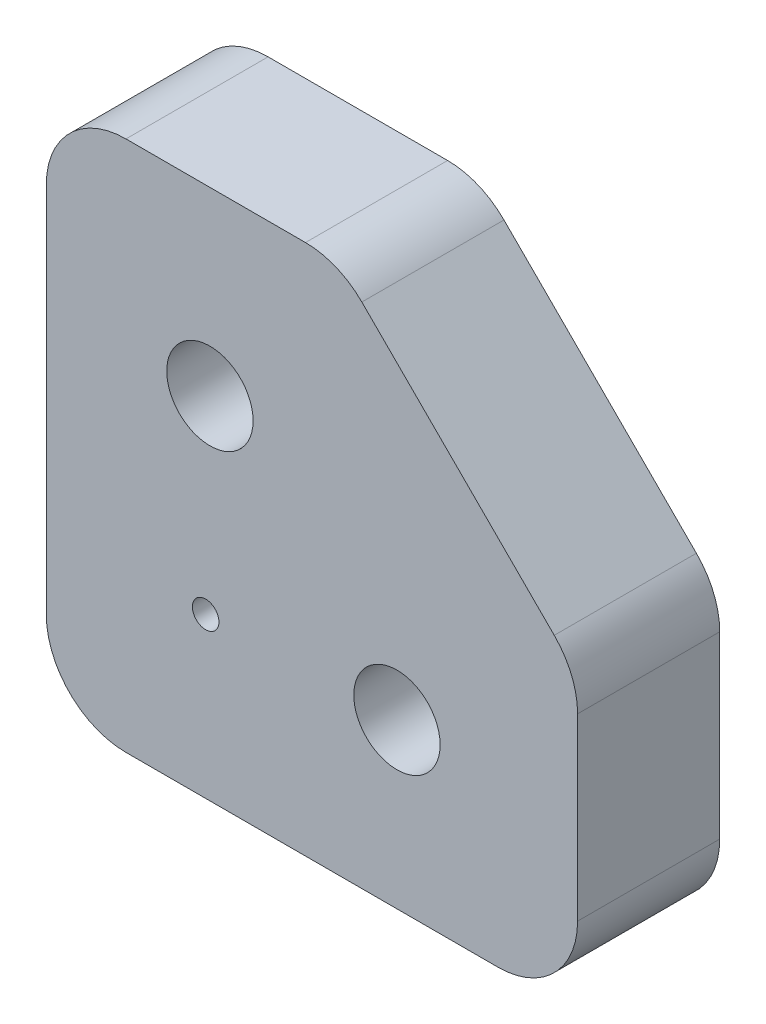
ISO-10303-21;
HEADER;
FILE_DESCRIPTION(('STEP AP214'),'2;1');
FILE_NAME('part.step','',(''),(''),'','','');
FILE_SCHEMA(('AUTOMOTIVE_DESIGN { 1 0 10303 214 1 1 1 1 }'));
ENDSEC;
DATA;
#1=APPLICATION_CONTEXT('core data for automotive mechanical design processes');
#2=APPLICATION_PROTOCOL_DEFINITION('international standard','automotive_design',2000,#1);
#3=PRODUCT_CONTEXT('',#1,'mechanical');
#4=PRODUCT('Part','Part','',(#3));
#5=PRODUCT_RELATED_PRODUCT_CATEGORY('part','',(#4));
#6=PRODUCT_DEFINITION_FORMATION('','',#4);
#7=PRODUCT_DEFINITION_CONTEXT('part definition',#1,'design');
#8=PRODUCT_DEFINITION('design','',#6,#7);
#9=PRODUCT_DEFINITION_SHAPE('','',#8);
#10=(LENGTH_UNIT() NAMED_UNIT(*) SI_UNIT(.MILLI.,.METRE.));
#11=(NAMED_UNIT(*) PLANE_ANGLE_UNIT() SI_UNIT($,.RADIAN.));
#12=(NAMED_UNIT(*) SI_UNIT($,.STERADIAN.) SOLID_ANGLE_UNIT());
#13=UNCERTAINTY_MEASURE_WITH_UNIT(LENGTH_MEASURE(1.E-05),#10,'distance_accuracy_value','');
#14=(GEOMETRIC_REPRESENTATION_CONTEXT(3) GLOBAL_UNCERTAINTY_ASSIGNED_CONTEXT((#13)) GLOBAL_UNIT_ASSIGNED_CONTEXT((#10,
#11,#12)) REPRESENTATION_CONTEXT('',''));
#15=CARTESIAN_POINT('',(0.,0.,0.));
#16=DIRECTION('',(0.,0.,1.));
#17=DIRECTION('',(1.,0.,0.));
#18=AXIS2_PLACEMENT_3D('',#15,#16,#17);
#19=CARTESIAN_POINT('',(0.,0.,5.35));
#20=DIRECTION('',(1.,0.,0.));
#21=DIRECTION('',(0.,0.,-1.));
#22=AXIS2_PLACEMENT_3D('',#19,#20,#21);
#23=PLANE('',#22);
#24=DIRECTION('',(0.,-1.,0.));
#25=VECTOR('',#24,1.);
#26=CARTESIAN_POINT('',(0.,0.,0.));
#27=LINE('',#26,#25);
#28=CARTESIAN_POINT('',(0.,16.9999995529,0.));
#29=VERTEX_POINT('',#28);
#30=CARTESIAN_POINT('',(0.,3.00000002599998,0.));
#31=VERTEX_POINT('',#30);
#32=EDGE_CURVE('E153',#29,#31,#27,.T.);
#33=ORIENTED_EDGE('',*,*,#32,.T.);
#34=DIRECTION('',(0.,0.,-1.));
#35=VECTOR('',#34,1.);
#36=CARTESIAN_POINT('',(0.,3.00000002599998,5.35));
#37=LINE('',#36,#35);
#38=CARTESIAN_POINT('',(0.,3.00000002599998,5.35));
#39=VERTEX_POINT('',#38);
#40=EDGE_CURVE('E11',#39,#31,#37,.T.);
#41=ORIENTED_EDGE('',*,*,#40,.F.);
#42=DIRECTION('',(0.,-1.,0.));
#43=VECTOR('',#42,1.);
#44=CARTESIAN_POINT('',(0.,0.,5.35));
#45=LINE('',#44,#43);
#46=CARTESIAN_POINT('',(0.,16.9999995529,5.35));
#47=VERTEX_POINT('',#46);
#48=EDGE_CURVE('E217',#47,#39,#45,.T.);
#49=ORIENTED_EDGE('',*,*,#48,.F.);
#50=DIRECTION('',(0.,0.,-1.));
#51=VECTOR('',#50,1.);
#52=CARTESIAN_POINT('',(0.,16.9999995529,5.35));
#53=LINE('',#52,#51);
#54=EDGE_CURVE('E140',#47,#29,#53,.T.);
#55=ORIENTED_EDGE('',*,*,#54,.T.);
#56=EDGE_LOOP('',(#33,#41,#49,#55));
#57=FACE_BOUND('',#56,.T.);
#58=ADVANCED_FACE('F35',(#57),#23,.F.);
#59=CARTESIAN_POINT('',(3.,3.,5.35));
#60=DIRECTION('',(0.,0.,-1.));
#61=DIRECTION('',(-1.,0.,0.));
#62=AXIS2_PLACEMENT_3D('',#59,#60,#61);
#63=CYLINDRICAL_SURFACE('',#62,3.);
#64=CARTESIAN_POINT('',(3.,3.,0.));
#65=DIRECTION('',(0.,0.,1.));
#66=DIRECTION('',(1.,0.,0.));
#67=AXIS2_PLACEMENT_3D('',#64,#65,#66);
#68=CIRCLE('',#67,3.);
#69=CARTESIAN_POINT('',(3.,0.,0.));
#70=VERTEX_POINT('',#69);
#71=EDGE_CURVE('E156',#31,#70,#68,.T.);
#72=ORIENTED_EDGE('',*,*,#71,.T.);
#73=DIRECTION('',(0.,0.,-1.));
#74=VECTOR('',#73,1.);
#75=CARTESIAN_POINT('',(3.,0.,5.35));
#76=LINE('',#75,#74);
#77=CARTESIAN_POINT('',(3.,0.,5.35));
#78=VERTEX_POINT('',#77);
#79=EDGE_CURVE('E44',#78,#70,#76,.T.);
#80=ORIENTED_EDGE('',*,*,#79,.F.);
#81=CARTESIAN_POINT('',(3.,3.,5.35));
#82=DIRECTION('',(0.,0.,1.));
#83=DIRECTION('',(1.,0.,0.));
#84=AXIS2_PLACEMENT_3D('',#81,#82,#83);
#85=CIRCLE('',#84,3.);
#86=EDGE_CURVE('E101',#39,#78,#85,.T.);
#87=ORIENTED_EDGE('',*,*,#86,.F.);
#88=ORIENTED_EDGE('',*,*,#40,.T.);
#89=EDGE_LOOP('',(#72,#80,#87,#88));
#90=FACE_BOUND('',#89,.T.);
#91=ADVANCED_FACE('F253',(#90),#63,.T.);
#92=CARTESIAN_POINT('',(0.,0.,5.35));
#93=DIRECTION('',(0.,1.,0.));
#94=DIRECTION('',(0.,0.,1.));
#95=AXIS2_PLACEMENT_3D('',#92,#93,#94);
#96=PLANE('',#95);
#97=DIRECTION('',(1.,0.,0.));
#98=VECTOR('',#97,1.);
#99=CARTESIAN_POINT('',(0.,0.,0.));
#100=LINE('',#99,#98);
#101=CARTESIAN_POINT('',(17.0000009239,0.,0.));
#102=VERTEX_POINT('',#101);
#103=EDGE_CURVE('E158',#70,#102,#100,.T.);
#104=ORIENTED_EDGE('',*,*,#103,.T.);
#105=DIRECTION('',(0.,0.,-1.));
#106=VECTOR('',#105,1.);
#107=CARTESIAN_POINT('',(17.0000009239,0.,5.35));
#108=LINE('',#107,#106);
#109=CARTESIAN_POINT('',(17.0000009239,0.,5.35));
#110=VERTEX_POINT('',#109);
#111=EDGE_CURVE('E184',#110,#102,#108,.T.);
#112=ORIENTED_EDGE('',*,*,#111,.F.);
#113=DIRECTION('',(1.,0.,0.));
#114=VECTOR('',#113,1.);
#115=CARTESIAN_POINT('',(0.,0.,5.35));
#116=LINE('',#115,#114);
#117=EDGE_CURVE('E192',#78,#110,#116,.T.);
#118=ORIENTED_EDGE('',*,*,#117,.F.);
#119=ORIENTED_EDGE('',*,*,#79,.T.);
#120=EDGE_LOOP('',(#104,#112,#118,#119));
#121=FACE_BOUND('',#120,.T.);
#122=ADVANCED_FACE('F190',(#121),#96,.F.);
#123=CARTESIAN_POINT('',(16.999999553,2.99999999999967,5.35));
#124=DIRECTION('',(0.,0.,-1.));
#125=DIRECTION('',(-1.,0.,0.));
#126=AXIS2_PLACEMENT_3D('',#123,#124,#125);
#127=CYLINDRICAL_SURFACE('',#126,2.99999999999999);
#128=CARTESIAN_POINT('',(16.999999553,2.99999999999967,0.));
#129=DIRECTION('',(0.,0.,1.));
#130=DIRECTION('',(1.,0.,0.));
#131=AXIS2_PLACEMENT_3D('',#128,#129,#130);
#132=CIRCLE('',#131,2.99999999999999);
#133=CARTESIAN_POINT('',(19.999999553,2.99999999999967,0.));
#134=VERTEX_POINT('',#133);
#135=EDGE_CURVE('E160',#102,#134,#132,.T.);
#136=ORIENTED_EDGE('',*,*,#135,.T.);
#137=DIRECTION('',(0.,0.,-1.));
#138=VECTOR('',#137,1.);
#139=CARTESIAN_POINT('',(19.999999553,2.99999999999967,5.35));
#140=LINE('',#139,#138);
#141=CARTESIAN_POINT('',(19.999999553,2.99999999999967,5.35));
#142=VERTEX_POINT('',#141);
#143=EDGE_CURVE('E181',#142,#134,#140,.T.);
#144=ORIENTED_EDGE('',*,*,#143,.F.);
#145=CARTESIAN_POINT('',(16.999999553,2.99999999999967,5.35));
#146=DIRECTION('',(0.,0.,1.));
#147=DIRECTION('',(1.,0.,0.));
#148=AXIS2_PLACEMENT_3D('',#145,#146,#147);
#149=CIRCLE('',#148,2.99999999999999);
#150=EDGE_CURVE('E210',#110,#142,#149,.T.);
#151=ORIENTED_EDGE('',*,*,#150,.F.);
#152=ORIENTED_EDGE('',*,*,#111,.T.);
#153=EDGE_LOOP('',(#136,#144,#151,#152));
#154=FACE_BOUND('',#153,.T.);
#155=ADVANCED_FACE('F201',(#154),#127,.T.);
#156=CARTESIAN_POINT('',(19.999999553,0.,5.35));
#157=DIRECTION('',(-1.,0.,0.));
#158=DIRECTION('',(0.,0.,1.));
#159=AXIS2_PLACEMENT_3D('',#156,#157,#158);
#160=PLANE('',#159);
#161=DIRECTION('',(0.,1.,0.));
#162=VECTOR('',#161,1.);
#163=CARTESIAN_POINT('',(19.999999553,0.,0.));
#164=LINE('',#163,#162);
#165=CARTESIAN_POINT('',(19.999999553,9.75735951210005,0.));
#166=VERTEX_POINT('',#165);
#167=EDGE_CURVE('E162',#134,#166,#164,.T.);
#168=ORIENTED_EDGE('',*,*,#167,.T.);
#169=DIRECTION('',(0.,0.,-1.));
#170=VECTOR('',#169,1.);
#171=CARTESIAN_POINT('',(19.999999553,9.75735951210005,5.35));
#172=LINE('',#171,#170);
#173=CARTESIAN_POINT('',(19.999999553,9.75735951210005,5.35));
#174=VERTEX_POINT('',#173);
#175=EDGE_CURVE('E178',#174,#166,#172,.T.);
#176=ORIENTED_EDGE('',*,*,#175,.F.);
#177=DIRECTION('',(0.,1.,0.));
#178=VECTOR('',#177,1.);
#179=CARTESIAN_POINT('',(19.999999553,0.,5.35));
#180=LINE('',#179,#178);
#181=EDGE_CURVE('E207',#142,#174,#180,.T.);
#182=ORIENTED_EDGE('',*,*,#181,.F.);
#183=ORIENTED_EDGE('',*,*,#143,.T.);
#184=EDGE_LOOP('',(#168,#176,#182,#183));
#185=FACE_BOUND('',#184,.T.);
#186=ADVANCED_FACE('F205',(#185),#160,.F.);
#187=CARTESIAN_POINT('',(16.9999995530002,9.75736018458046,5.35));
#188=DIRECTION('',(0.,0.,-1.));
#189=DIRECTION('',(-1.,0.,0.));
#190=AXIS2_PLACEMENT_3D('',#187,#188,#189);
#191=CYLINDRICAL_SURFACE('',#190,2.99999999999992);
#192=CARTESIAN_POINT('',(16.9999995530002,9.75736018458046,0.));
#193=DIRECTION('',(0.,0.,1.));
#194=DIRECTION('',(1.,0.,0.));
#195=AXIS2_PLACEMENT_3D('',#192,#193,#194);
#196=CIRCLE('',#195,2.99999999999992);
#197=CARTESIAN_POINT('',(19.1213198965595,11.8786805281405,0.));
#198=VERTEX_POINT('',#197);
#199=EDGE_CURVE('E164',#166,#198,#196,.T.);
#200=ORIENTED_EDGE('',*,*,#199,.T.);
#201=DIRECTION('',(0.,0.,-1.));
#202=VECTOR('',#201,1.);
#203=CARTESIAN_POINT('',(19.1213198965595,11.8786805281405,5.35));
#204=LINE('',#203,#202);
#205=CARTESIAN_POINT('',(19.1213198965595,11.8786805281405,5.35));
#206=VERTEX_POINT('',#205);
#207=EDGE_CURVE('E175',#206,#198,#204,.T.);
#208=ORIENTED_EDGE('',*,*,#207,.F.);
#209=CARTESIAN_POINT('',(16.9999995530002,9.75736018458046,5.35));
#210=DIRECTION('',(0.,0.,1.));
#211=DIRECTION('',(1.,0.,0.));
#212=AXIS2_PLACEMENT_3D('',#209,#210,#211);
#213=CIRCLE('',#212,2.99999999999992);
#214=EDGE_CURVE('E209',#174,#206,#213,.T.);
#215=ORIENTED_EDGE('',*,*,#214,.F.);
#216=ORIENTED_EDGE('',*,*,#175,.T.);
#217=EDGE_LOOP('',(#200,#208,#215,#216));
#218=FACE_BOUND('',#217,.T.);
#219=ADVANCED_FACE('F281',(#218),#191,.T.);
#220=CARTESIAN_POINT('',(15.50000021235,15.50000021235,5.35));
#221=DIRECTION('',(-0.707106781186549,-0.707106781186546,0.));
#222=DIRECTION('',(0.707106781186546,-0.707106781186549,0.));
#223=AXIS2_PLACEMENT_3D('',#220,#221,#222);
#224=PLANE('',#223);
#225=DIRECTION('',(-0.707106781186546,0.707106781186549,0.));
#226=VECTOR('',#225,1.);
#227=CARTESIAN_POINT('',(15.50000021235,15.50000021235,0.));
#228=LINE('',#227,#226);
#229=CARTESIAN_POINT('',(11.8786795065,19.1213209182,0.));
#230=VERTEX_POINT('',#229);
#231=EDGE_CURVE('E166',#198,#230,#228,.T.);
#232=ORIENTED_EDGE('',*,*,#231,.T.);
#233=DIRECTION('',(0.,0.,-1.));
#234=VECTOR('',#233,1.);
#235=CARTESIAN_POINT('',(11.8786795065,19.1213209182,5.35));
#236=LINE('',#235,#234);
#237=CARTESIAN_POINT('',(11.8786795065,19.1213209182,5.35));
#238=VERTEX_POINT('',#237);
#239=EDGE_CURVE('E135',#238,#230,#236,.T.);
#240=ORIENTED_EDGE('',*,*,#239,.F.);
#241=DIRECTION('',(-0.707106781186546,0.707106781186549,0.));
#242=VECTOR('',#241,1.);
#243=CARTESIAN_POINT('',(15.50000021235,15.50000021235,5.35));
#244=LINE('',#243,#242);
#245=EDGE_CURVE('E126',#206,#238,#244,.T.);
#246=ORIENTED_EDGE('',*,*,#245,.F.);
#247=ORIENTED_EDGE('',*,*,#207,.T.);
#248=EDGE_LOOP('',(#232,#240,#246,#247));
#249=FACE_BOUND('',#248,.T.);
#250=ADVANCED_FACE('F278',(#249),#224,.F.);
#251=CARTESIAN_POINT('',(9.75736018468114,16.9999995529001,5.35));
#252=DIRECTION('',(0.,0.,-1.));
#253=DIRECTION('',(-1.,0.,0.));
#254=AXIS2_PLACEMENT_3D('',#251,#252,#253);
#255=CYLINDRICAL_SURFACE('',#254,2.99999999999993);
#256=CARTESIAN_POINT('',(9.75736018468114,16.9999995529001,0.));
#257=DIRECTION('',(0.,0.,1.));
#258=DIRECTION('',(1.,0.,0.));
#259=AXIS2_PLACEMENT_3D('',#256,#257,#258);
#260=CIRCLE('',#259,2.99999999999993);
#261=CARTESIAN_POINT('',(9.75736018468114,19.9999995529,0.));
#262=VERTEX_POINT('',#261);
#263=EDGE_CURVE('E134',#230,#262,#260,.T.);
#264=ORIENTED_EDGE('',*,*,#263,.T.);
#265=DIRECTION('',(0.,0.,-1.));
#266=VECTOR('',#265,1.);
#267=CARTESIAN_POINT('',(9.75736018468114,19.9999995529,5.35));
#268=LINE('',#267,#266);
#269=CARTESIAN_POINT('',(9.75736018468114,19.9999995529,5.35));
#270=VERTEX_POINT('',#269);
#271=EDGE_CURVE('E131',#270,#262,#268,.T.);
#272=ORIENTED_EDGE('',*,*,#271,.F.);
#273=CARTESIAN_POINT('',(9.75736018468114,16.9999995529001,5.35));
#274=DIRECTION('',(0.,0.,1.));
#275=DIRECTION('',(1.,0.,0.));
#276=AXIS2_PLACEMENT_3D('',#273,#274,#275);
#277=CIRCLE('',#276,2.99999999999993);
#278=EDGE_CURVE('E120',#238,#270,#277,.T.);
#279=ORIENTED_EDGE('',*,*,#278,.F.);
#280=ORIENTED_EDGE('',*,*,#239,.T.);
#281=EDGE_LOOP('',(#264,#272,#279,#280));
#282=FACE_BOUND('',#281,.T.);
#283=ADVANCED_FACE('F132',(#282),#255,.T.);
#284=CARTESIAN_POINT('',(0.,19.9999995529,5.35));
#285=DIRECTION('',(0.,-1.,0.));
#286=DIRECTION('',(0.,0.,-1.));
#287=AXIS2_PLACEMENT_3D('',#284,#285,#286);
#288=PLANE('',#287);
#289=DIRECTION('',(-1.,0.,0.));
#290=VECTOR('',#289,1.);
#291=CARTESIAN_POINT('',(0.,19.9999995529,0.));
#292=LINE('',#291,#290);
#293=CARTESIAN_POINT('',(3.0000000261,19.9999995529,0.));
#294=VERTEX_POINT('',#293);
#295=EDGE_CURVE('E87',#262,#294,#292,.T.);
#296=ORIENTED_EDGE('',*,*,#295,.T.);
#297=DIRECTION('',(0.,0.,-1.));
#298=VECTOR('',#297,1.);
#299=CARTESIAN_POINT('',(3.0000000261,19.9999995529,5.35));
#300=LINE('',#299,#298);
#301=CARTESIAN_POINT('',(3.0000000261,19.9999995529,5.35));
#302=VERTEX_POINT('',#301);
#303=EDGE_CURVE('E136',#302,#294,#300,.T.);
#304=ORIENTED_EDGE('',*,*,#303,.F.);
#305=DIRECTION('',(-1.,0.,0.));
#306=VECTOR('',#305,1.);
#307=CARTESIAN_POINT('',(0.,19.9999995529,5.35));
#308=LINE('',#307,#306);
#309=EDGE_CURVE('E124',#270,#302,#308,.T.);
#310=ORIENTED_EDGE('',*,*,#309,.F.);
#311=ORIENTED_EDGE('',*,*,#271,.T.);
#312=EDGE_LOOP('',(#296,#304,#310,#311));
#313=FACE_BOUND('',#312,.T.);
#314=ADVANCED_FACE('F138',(#313),#288,.F.);
#315=CARTESIAN_POINT('',(6.00000000000001,6.00000000000001,5.35));
#316=DIRECTION('',(0.,0.,-1.));
#317=DIRECTION('',(-1.,0.,0.));
#318=AXIS2_PLACEMENT_3D('',#315,#316,#317);
#319=CYLINDRICAL_SURFACE('',#318,0.499999999999999);
#320=CARTESIAN_POINT('',(6.00000000000001,6.00000000000001,5.35));
#321=DIRECTION('',(0.,0.,1.));
#322=DIRECTION('',(1.,0.,0.));
#323=AXIS2_PLACEMENT_3D('',#320,#321,#322);
#324=CIRCLE('',#323,0.499999999999999);
#325=CARTESIAN_POINT('',(6.5,6.00000000000001,5.35));
#326=VERTEX_POINT('',#325);
#327=EDGE_CURVE('E219',#326,#326,#324,.T.);
#328=ORIENTED_EDGE('',*,*,#327,.T.);
#329=EDGE_LOOP('',(#328));
#330=FACE_BOUND('',#329,.T.);
#331=CARTESIAN_POINT('',(6.00000000000001,6.00000000000001,0.));
#332=DIRECTION('',(0.,0.,1.));
#333=DIRECTION('',(1.,0.,0.));
#334=AXIS2_PLACEMENT_3D('',#331,#332,#333);
#335=CIRCLE('',#334,0.499999999999999);
#336=CARTESIAN_POINT('',(6.5,6.00000000000001,0.));
#337=VERTEX_POINT('',#336);
#338=EDGE_CURVE('E150',#337,#337,#335,.T.);
#339=ORIENTED_EDGE('',*,*,#338,.F.);
#340=EDGE_LOOP('',(#339));
#341=FACE_BOUND('',#340,.T.);
#342=ADVANCED_FACE('F238',(#330,#341),#319,.F.);
#343=CARTESIAN_POINT('',(13.2,6.16,5.35));
#344=DIRECTION('',(0.,0.,-1.));
#345=DIRECTION('',(-1.,0.,0.));
#346=AXIS2_PLACEMENT_3D('',#343,#344,#345);
#347=CYLINDRICAL_SURFACE('',#346,1.62499999999999);
#348=CARTESIAN_POINT('',(13.2,6.16,5.35));
#349=DIRECTION('',(0.,0.,1.));
#350=DIRECTION('',(1.,0.,0.));
#351=AXIS2_PLACEMENT_3D('',#348,#349,#350);
#352=CIRCLE('',#351,1.62499999999999);
#353=CARTESIAN_POINT('',(14.825,6.16,5.35));
#354=VERTEX_POINT('',#353);
#355=EDGE_CURVE('E222',#354,#354,#352,.T.);
#356=ORIENTED_EDGE('',*,*,#355,.T.);
#357=EDGE_LOOP('',(#356));
#358=FACE_BOUND('',#357,.T.);
#359=CARTESIAN_POINT('',(13.2,6.16,0.));
#360=DIRECTION('',(0.,0.,1.));
#361=DIRECTION('',(1.,0.,0.));
#362=AXIS2_PLACEMENT_3D('',#359,#360,#361);
#363=CIRCLE('',#362,1.62499999999999);
#364=CARTESIAN_POINT('',(14.825,6.16,0.));
#365=VERTEX_POINT('',#364);
#366=EDGE_CURVE('E147',#365,#365,#363,.T.);
#367=ORIENTED_EDGE('',*,*,#366,.F.);
#368=EDGE_LOOP('',(#367));
#369=FACE_BOUND('',#368,.T.);
#370=ADVANCED_FACE('F241',(#358,#369),#347,.F.);
#371=CARTESIAN_POINT('',(6.16000000000001,13.2,5.35));
#372=DIRECTION('',(0.,0.,-1.));
#373=DIRECTION('',(-1.,0.,0.));
#374=AXIS2_PLACEMENT_3D('',#371,#372,#373);
#375=CYLINDRICAL_SURFACE('',#374,1.625);
#376=CARTESIAN_POINT('',(6.16000000000001,13.2,5.35));
#377=DIRECTION('',(0.,0.,1.));
#378=DIRECTION('',(1.,0.,0.));
#379=AXIS2_PLACEMENT_3D('',#376,#377,#378);
#380=CIRCLE('',#379,1.625);
#381=CARTESIAN_POINT('',(7.785,13.2,5.35));
#382=VERTEX_POINT('',#381);
#383=EDGE_CURVE('E171',#382,#382,#380,.T.);
#384=ORIENTED_EDGE('',*,*,#383,.T.);
#385=EDGE_LOOP('',(#384));
#386=FACE_BOUND('',#385,.T.);
#387=CARTESIAN_POINT('',(6.16000000000001,13.2,0.));
#388=DIRECTION('',(0.,0.,1.));
#389=DIRECTION('',(1.,0.,0.));
#390=AXIS2_PLACEMENT_3D('',#387,#388,#389);
#391=CIRCLE('',#390,1.625);
#392=CARTESIAN_POINT('',(7.785,13.2,0.));
#393=VERTEX_POINT('',#392);
#394=EDGE_CURVE('E144',#393,#393,#391,.T.);
#395=ORIENTED_EDGE('',*,*,#394,.F.);
#396=EDGE_LOOP('',(#395));
#397=FACE_BOUND('',#396,.T.);
#398=ADVANCED_FACE('F37',(#386,#397),#375,.F.);
#399=CARTESIAN_POINT('',(2.99999999999969,16.9999995529,5.35));
#400=DIRECTION('',(0.,0.,-1.));
#401=DIRECTION('',(-1.,0.,0.));
#402=AXIS2_PLACEMENT_3D('',#399,#400,#401);
#403=CYLINDRICAL_SURFACE('',#402,2.99999999999985);
#404=CARTESIAN_POINT('',(2.99999999999969,16.9999995529,0.));
#405=DIRECTION('',(0.,0.,1.));
#406=DIRECTION('',(1.,0.,0.));
#407=AXIS2_PLACEMENT_3D('',#404,#405,#406);
#408=CIRCLE('',#407,2.99999999999985);
#409=EDGE_CURVE('E93',#294,#29,#408,.T.);
#410=ORIENTED_EDGE('',*,*,#409,.T.);
#411=ORIENTED_EDGE('',*,*,#54,.F.);
#412=CARTESIAN_POINT('',(2.99999999999969,16.9999995529,5.35));
#413=DIRECTION('',(0.,0.,1.));
#414=DIRECTION('',(1.,0.,0.));
#415=AXIS2_PLACEMENT_3D('',#412,#413,#414);
#416=CIRCLE('',#415,2.99999999999985);
#417=EDGE_CURVE('E52',#302,#47,#416,.T.);
#418=ORIENTED_EDGE('',*,*,#417,.F.);
#419=ORIENTED_EDGE('',*,*,#303,.T.);
#420=EDGE_LOOP('',(#410,#411,#418,#419));
#421=FACE_BOUND('',#420,.T.);
#422=ADVANCED_FACE('F232',(#421),#403,.T.);
#423=CARTESIAN_POINT('',(0.,0.,5.35));
#424=DIRECTION('',(0.,0.,1.));
#425=DIRECTION('',(1.,0.,0.));
#426=AXIS2_PLACEMENT_3D('',#423,#424,#425);
#427=PLANE('',#426);
#428=ORIENTED_EDGE('',*,*,#383,.F.);
#429=EDGE_LOOP('',(#428));
#430=FACE_BOUND('',#429,.T.);
#431=ORIENTED_EDGE('',*,*,#355,.F.);
#432=EDGE_LOOP('',(#431));
#433=FACE_BOUND('',#432,.T.);
#434=ORIENTED_EDGE('',*,*,#327,.F.);
#435=EDGE_LOOP('',(#434));
#436=FACE_BOUND('',#435,.T.);
#437=ORIENTED_EDGE('',*,*,#48,.T.);
#438=ORIENTED_EDGE('',*,*,#86,.T.);
#439=ORIENTED_EDGE('',*,*,#117,.T.);
#440=ORIENTED_EDGE('',*,*,#150,.T.);
#441=ORIENTED_EDGE('',*,*,#181,.T.);
#442=ORIENTED_EDGE('',*,*,#214,.T.);
#443=ORIENTED_EDGE('',*,*,#245,.T.);
#444=ORIENTED_EDGE('',*,*,#278,.T.);
#445=ORIENTED_EDGE('',*,*,#309,.T.);
#446=ORIENTED_EDGE('',*,*,#417,.T.);
#447=EDGE_LOOP('',(#437,#438,#439,#440,#441,#442,#443,#444,#445,#446));
#448=FACE_BOUND('',#447,.T.);
#449=ADVANCED_FACE('F122',(#430,#433,#436,#448),#427,.T.);
#450=CARTESIAN_POINT('',(0.,0.,0.));
#451=DIRECTION('',(0.,0.,1.));
#452=DIRECTION('',(1.,0.,0.));
#453=AXIS2_PLACEMENT_3D('',#450,#451,#452);
#454=PLANE('',#453);
#455=ORIENTED_EDGE('',*,*,#394,.T.);
#456=EDGE_LOOP('',(#455));
#457=FACE_BOUND('',#456,.T.);
#458=ORIENTED_EDGE('',*,*,#366,.T.);
#459=EDGE_LOOP('',(#458));
#460=FACE_BOUND('',#459,.T.);
#461=ORIENTED_EDGE('',*,*,#338,.T.);
#462=EDGE_LOOP('',(#461));
#463=FACE_BOUND('',#462,.T.);
#464=ORIENTED_EDGE('',*,*,#32,.F.);
#465=ORIENTED_EDGE('',*,*,#409,.F.);
#466=ORIENTED_EDGE('',*,*,#295,.F.);
#467=ORIENTED_EDGE('',*,*,#263,.F.);
#468=ORIENTED_EDGE('',*,*,#231,.F.);
#469=ORIENTED_EDGE('',*,*,#199,.F.);
#470=ORIENTED_EDGE('',*,*,#167,.F.);
#471=ORIENTED_EDGE('',*,*,#135,.F.);
#472=ORIENTED_EDGE('',*,*,#103,.F.);
#473=ORIENTED_EDGE('',*,*,#71,.F.);
#474=EDGE_LOOP('',(#464,#465,#466,#467,#468,#469,#470,#471,#472,#473));
#475=FACE_BOUND('',#474,.T.);
#476=ADVANCED_FACE('F196',(#457,#460,#463,#475),#454,.F.);
#477=CLOSED_SHELL('',(#58,#91,#122,#155,#186,#219,#250,#283,#314,#342,#370,#398,#422,#449,#476));
#478=MANIFOLD_SOLID_BREP('B2',#477);
#479=ADVANCED_BREP_SHAPE_REPRESENTATION('',(#18,#478),#14);
#480=SHAPE_DEFINITION_REPRESENTATION(#9,#479);
ENDSEC;
END-ISO-10303-21;
